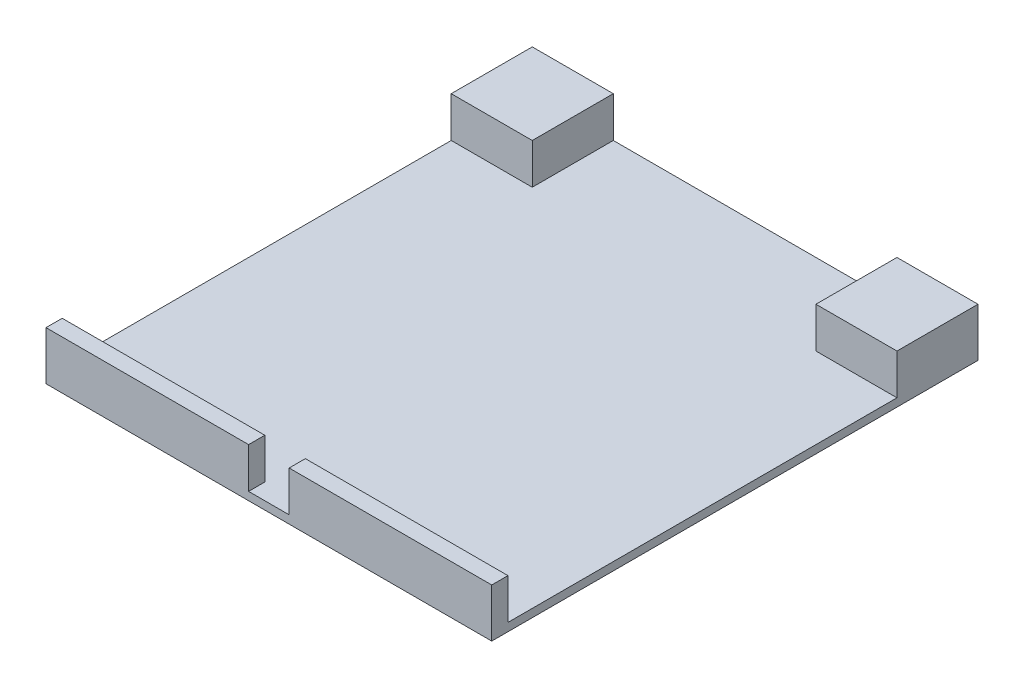
ISO-10303-21;
HEADER;
FILE_DESCRIPTION(('STEP AP214'),'2;1');
FILE_NAME('part.step','',(''),(''),'','','');
FILE_SCHEMA(('AUTOMOTIVE_DESIGN { 1 0 10303 214 1 1 1 1 }'));
ENDSEC;
DATA;
#1=APPLICATION_CONTEXT('core data for automotive mechanical design processes');
#2=APPLICATION_PROTOCOL_DEFINITION('international standard','automotive_design',2000,#1);
#3=PRODUCT_CONTEXT('',#1,'mechanical');
#4=PRODUCT('Part','Part','',(#3));
#5=PRODUCT_RELATED_PRODUCT_CATEGORY('part','',(#4));
#6=PRODUCT_DEFINITION_FORMATION('','',#4);
#7=PRODUCT_DEFINITION_CONTEXT('part definition',#1,'design');
#8=PRODUCT_DEFINITION('design','',#6,#7);
#9=PRODUCT_DEFINITION_SHAPE('','',#8);
#10=(LENGTH_UNIT() NAMED_UNIT(*) SI_UNIT(.MILLI.,.METRE.));
#11=(NAMED_UNIT(*) PLANE_ANGLE_UNIT() SI_UNIT($,.RADIAN.));
#12=(NAMED_UNIT(*) SI_UNIT($,.STERADIAN.) SOLID_ANGLE_UNIT());
#13=UNCERTAINTY_MEASURE_WITH_UNIT(LENGTH_MEASURE(1.E-05),#10,'distance_accuracy_value','');
#14=(GEOMETRIC_REPRESENTATION_CONTEXT(3) GLOBAL_UNCERTAINTY_ASSIGNED_CONTEXT((#13)) GLOBAL_UNIT_ASSIGNED_CONTEXT((#10,
#11,#12)) REPRESENTATION_CONTEXT('',''));
#15=CARTESIAN_POINT('',(0.,0.,0.));
#16=DIRECTION('',(0.,0.,1.));
#17=DIRECTION('',(1.,0.,0.));
#18=AXIS2_PLACEMENT_3D('',#15,#16,#17);
#19=CARTESIAN_POINT('',(0.,1.27,0.));
#20=DIRECTION('',(0.,1.,0.));
#21=DIRECTION('',(0.,0.,1.));
#22=AXIS2_PLACEMENT_3D('',#19,#20,#21);
#23=PLANE('',#22);
#24=DIRECTION('',(0.,0.,1.));
#25=VECTOR('',#24,1.);
#26=CARTESIAN_POINT('',(3.17500000000001,1.27,35.56));
#27=LINE('',#26,#25);
#28=CARTESIAN_POINT('',(3.17500000000001,1.27,35.56));
#29=VERTEX_POINT('',#28);
#30=CARTESIAN_POINT('',(3.17500000000001,1.27,38.1));
#31=VERTEX_POINT('',#30);
#32=EDGE_CURVE('E56',#29,#31,#27,.T.);
#33=ORIENTED_EDGE('',*,*,#32,.F.);
#34=DIRECTION('',(-1.,0.,0.));
#35=VECTOR('',#34,1.);
#36=CARTESIAN_POINT('',(3.17500000000001,1.27,35.56));
#37=LINE('',#36,#35);
#38=CARTESIAN_POINT('',(34.925,1.27,35.56));
#39=VERTEX_POINT('',#38);
#40=EDGE_CURVE('E60',#39,#29,#37,.T.);
#41=ORIENTED_EDGE('',*,*,#40,.F.);
#42=DIRECTION('',(0.,0.,-1.));
#43=VECTOR('',#42,1.);
#44=CARTESIAN_POINT('',(34.925,1.27,-38.1));
#45=LINE('',#44,#43);
#46=CARTESIAN_POINT('',(34.925,1.27,-25.4));
#47=VERTEX_POINT('',#46);
#48=EDGE_CURVE('E174',#39,#47,#45,.T.);
#49=ORIENTED_EDGE('',*,*,#48,.T.);
#50=DIRECTION('',(1.,0.,0.));
#51=VECTOR('',#50,1.);
#52=CARTESIAN_POINT('',(22.225,1.27,-25.4));
#53=LINE('',#52,#51);
#54=CARTESIAN_POINT('',(22.225,1.27,-25.4));
#55=VERTEX_POINT('',#54);
#56=EDGE_CURVE('E178',#55,#47,#53,.T.);
#57=ORIENTED_EDGE('',*,*,#56,.F.);
#58=DIRECTION('',(0.,0.,1.));
#59=VECTOR('',#58,1.);
#60=CARTESIAN_POINT('',(22.225,1.27,-38.1));
#61=LINE('',#60,#59);
#62=CARTESIAN_POINT('',(22.225,1.27,-38.1));
#63=VERTEX_POINT('',#62);
#64=EDGE_CURVE('E175',#63,#55,#61,.T.);
#65=ORIENTED_EDGE('',*,*,#64,.F.);
#66=DIRECTION('',(-1.,0.,0.));
#67=VECTOR('',#66,1.);
#68=CARTESIAN_POINT('',(-34.925,1.27,-38.1));
#69=LINE('',#68,#67);
#70=CARTESIAN_POINT('',(-22.225,1.27,-38.1));
#71=VERTEX_POINT('',#70);
#72=EDGE_CURVE('E255',#63,#71,#69,.T.);
#73=ORIENTED_EDGE('',*,*,#72,.T.);
#74=DIRECTION('',(0.,0.,-1.));
#75=VECTOR('',#74,1.);
#76=CARTESIAN_POINT('',(-22.225,1.27,-38.1));
#77=LINE('',#76,#75);
#78=CARTESIAN_POINT('',(-22.225,1.27,-25.4));
#79=VERTEX_POINT('',#78);
#80=EDGE_CURVE('E228',#79,#71,#77,.T.);
#81=ORIENTED_EDGE('',*,*,#80,.F.);
#82=DIRECTION('',(1.,0.,0.));
#83=VECTOR('',#82,1.);
#84=CARTESIAN_POINT('',(-34.925,1.27,-25.4));
#85=LINE('',#84,#83);
#86=CARTESIAN_POINT('',(-34.925,1.27,-25.4));
#87=VERTEX_POINT('',#86);
#88=EDGE_CURVE('E233',#87,#79,#85,.T.);
#89=ORIENTED_EDGE('',*,*,#88,.F.);
#90=DIRECTION('',(0.,0.,1.));
#91=VECTOR('',#90,1.);
#92=CARTESIAN_POINT('',(-34.925,1.27,-38.1));
#93=LINE('',#92,#91);
#94=CARTESIAN_POINT('',(-34.925,1.27,35.56));
#95=VERTEX_POINT('',#94);
#96=EDGE_CURVE('E258',#87,#95,#93,.T.);
#97=ORIENTED_EDGE('',*,*,#96,.T.);
#98=DIRECTION('',(-1.,0.,0.));
#99=VECTOR('',#98,1.);
#100=CARTESIAN_POINT('',(-34.925,1.27,35.56));
#101=LINE('',#100,#99);
#102=CARTESIAN_POINT('',(-3.17499999999999,1.27,35.56));
#103=VERTEX_POINT('',#102);
#104=EDGE_CURVE('E208',#103,#95,#101,.T.);
#105=ORIENTED_EDGE('',*,*,#104,.F.);
#106=DIRECTION('',(0.,0.,-1.));
#107=VECTOR('',#106,1.);
#108=CARTESIAN_POINT('',(-3.17499999999999,1.27,35.56));
#109=LINE('',#108,#107);
#110=CARTESIAN_POINT('',(-3.17499999999999,1.27,38.1));
#111=VERTEX_POINT('',#110);
#112=EDGE_CURVE('E203',#111,#103,#109,.T.);
#113=ORIENTED_EDGE('',*,*,#112,.F.);
#114=DIRECTION('',(1.,0.,0.));
#115=VECTOR('',#114,1.);
#116=CARTESIAN_POINT('',(-34.925,1.27,38.1));
#117=LINE('',#116,#115);
#118=EDGE_CURVE('E260',#111,#31,#117,.T.);
#119=ORIENTED_EDGE('',*,*,#118,.T.);
#120=EDGE_LOOP('',(#33,#41,#49,#57,#65,#73,#81,#89,#97,#105,#113,#119));
#121=FACE_BOUND('',#120,.T.);
#122=ADVANCED_FACE('F41',(#121),#23,.T.);
#123=CARTESIAN_POINT('',(34.925,1.27,-38.1));
#124=DIRECTION('',(-1.,0.,0.));
#125=DIRECTION('',(0.,0.,1.));
#126=AXIS2_PLACEMENT_3D('',#123,#124,#125);
#127=PLANE('',#126);
#128=DIRECTION('',(0.,0.,-1.));
#129=VECTOR('',#128,1.);
#130=CARTESIAN_POINT('',(34.925,0.,-38.1));
#131=LINE('',#130,#129);
#132=CARTESIAN_POINT('',(34.925,0.,38.1));
#133=VERTEX_POINT('',#132);
#134=CARTESIAN_POINT('',(34.925,0.,-38.1));
#135=VERTEX_POINT('',#134);
#136=EDGE_CURVE('E253',#133,#135,#131,.T.);
#137=ORIENTED_EDGE('',*,*,#136,.T.);
#138=DIRECTION('',(0.,-1.,0.));
#139=VECTOR('',#138,1.);
#140=CARTESIAN_POINT('',(34.925,1.27,-38.1));
#141=LINE('',#140,#139);
#142=CARTESIAN_POINT('',(34.925,7.62,-38.1));
#143=VERTEX_POINT('',#142);
#144=EDGE_CURVE('E11',#143,#135,#141,.T.);
#145=ORIENTED_EDGE('',*,*,#144,.F.);
#146=DIRECTION('',(0.,0.,-1.));
#147=VECTOR('',#146,1.);
#148=CARTESIAN_POINT('',(34.925,7.62,-38.1));
#149=LINE('',#148,#147);
#150=CARTESIAN_POINT('',(34.925,7.62,-25.4));
#151=VERTEX_POINT('',#150);
#152=EDGE_CURVE('E184',#151,#143,#149,.T.);
#153=ORIENTED_EDGE('',*,*,#152,.F.);
#154=DIRECTION('',(0.,-1.,0.));
#155=VECTOR('',#154,1.);
#156=CARTESIAN_POINT('',(34.925,7.62,-25.4));
#157=LINE('',#156,#155);
#158=EDGE_CURVE('E192',#151,#47,#157,.T.);
#159=ORIENTED_EDGE('',*,*,#158,.T.);
#160=ORIENTED_EDGE('',*,*,#48,.F.);
#161=DIRECTION('',(0.,-1.,0.));
#162=VECTOR('',#161,1.);
#163=CARTESIAN_POINT('',(34.925,7.62,35.56));
#164=LINE('',#163,#162);
#165=CARTESIAN_POINT('',(34.925,7.62,35.56));
#166=VERTEX_POINT('',#165);
#167=EDGE_CURVE('E156',#166,#39,#164,.T.);
#168=ORIENTED_EDGE('',*,*,#167,.F.);
#169=DIRECTION('',(0.,0.,-1.));
#170=VECTOR('',#169,1.);
#171=CARTESIAN_POINT('',(34.925,7.62,35.56));
#172=LINE('',#171,#170);
#173=CARTESIAN_POINT('',(34.925,7.62,38.1));
#174=VERTEX_POINT('',#173);
#175=EDGE_CURVE('E162',#174,#166,#172,.T.);
#176=ORIENTED_EDGE('',*,*,#175,.F.);
#177=DIRECTION('',(0.,-1.,0.));
#178=VECTOR('',#177,1.);
#179=CARTESIAN_POINT('',(34.925,1.27,38.1));
#180=LINE('',#179,#178);
#181=EDGE_CURVE('E262',#174,#133,#180,.T.);
#182=ORIENTED_EDGE('',*,*,#181,.T.);
#183=EDGE_LOOP('',(#137,#145,#153,#159,#160,#168,#176,#182));
#184=FACE_BOUND('',#183,.T.);
#185=ADVANCED_FACE('F43',(#184),#127,.F.);
#186=CARTESIAN_POINT('',(-34.925,1.27,-38.1));
#187=DIRECTION('',(0.,0.,1.));
#188=DIRECTION('',(1.,0.,0.));
#189=AXIS2_PLACEMENT_3D('',#186,#187,#188);
#190=PLANE('',#189);
#191=DIRECTION('',(-1.,0.,0.));
#192=VECTOR('',#191,1.);
#193=CARTESIAN_POINT('',(-34.925,0.,-38.1));
#194=LINE('',#193,#192);
#195=CARTESIAN_POINT('',(-34.925,0.,-38.1));
#196=VERTEX_POINT('',#195);
#197=EDGE_CURVE('E264',#135,#196,#194,.T.);
#198=ORIENTED_EDGE('',*,*,#197,.T.);
#199=DIRECTION('',(0.,-1.,0.));
#200=VECTOR('',#199,1.);
#201=CARTESIAN_POINT('',(-34.925,1.27,-38.1));
#202=LINE('',#201,#200);
#203=CARTESIAN_POINT('',(-34.925,7.62,-38.1));
#204=VERTEX_POINT('',#203);
#205=EDGE_CURVE('E49',#204,#196,#202,.T.);
#206=ORIENTED_EDGE('',*,*,#205,.F.);
#207=DIRECTION('',(-1.,0.,0.));
#208=VECTOR('',#207,1.);
#209=CARTESIAN_POINT('',(-34.925,7.62,-38.1));
#210=LINE('',#209,#208);
#211=CARTESIAN_POINT('',(-22.225,7.62,-38.1));
#212=VERTEX_POINT('',#211);
#213=EDGE_CURVE('E232',#212,#204,#210,.T.);
#214=ORIENTED_EDGE('',*,*,#213,.F.);
#215=DIRECTION('',(0.,-1.,0.));
#216=VECTOR('',#215,1.);
#217=CARTESIAN_POINT('',(-22.225,7.62,-38.1));
#218=LINE('',#217,#216);
#219=EDGE_CURVE('E250',#212,#71,#218,.T.);
#220=ORIENTED_EDGE('',*,*,#219,.T.);
#221=ORIENTED_EDGE('',*,*,#72,.F.);
#222=DIRECTION('',(0.,-1.,0.));
#223=VECTOR('',#222,1.);
#224=CARTESIAN_POINT('',(22.225,7.62,-38.1));
#225=LINE('',#224,#223);
#226=CARTESIAN_POINT('',(22.225,7.62,-38.1));
#227=VERTEX_POINT('',#226);
#228=EDGE_CURVE('E200',#227,#63,#225,.T.);
#229=ORIENTED_EDGE('',*,*,#228,.F.);
#230=DIRECTION('',(-1.,0.,0.));
#231=VECTOR('',#230,1.);
#232=CARTESIAN_POINT('',(22.225,7.62,-38.1));
#233=LINE('',#232,#231);
#234=EDGE_CURVE('E187',#143,#227,#233,.T.);
#235=ORIENTED_EDGE('',*,*,#234,.F.);
#236=ORIENTED_EDGE('',*,*,#144,.T.);
#237=EDGE_LOOP('',(#198,#206,#214,#220,#221,#229,#235,#236));
#238=FACE_BOUND('',#237,.T.);
#239=ADVANCED_FACE('F289',(#238),#190,.F.);
#240=CARTESIAN_POINT('',(-34.925,1.27,-38.1));
#241=DIRECTION('',(1.,0.,0.));
#242=DIRECTION('',(0.,0.,-1.));
#243=AXIS2_PLACEMENT_3D('',#240,#241,#242);
#244=PLANE('',#243);
#245=DIRECTION('',(0.,0.,1.));
#246=VECTOR('',#245,1.);
#247=CARTESIAN_POINT('',(-34.925,0.,-38.1));
#248=LINE('',#247,#246);
#249=CARTESIAN_POINT('',(-34.925,0.,38.1));
#250=VERTEX_POINT('',#249);
#251=EDGE_CURVE('E266',#196,#250,#248,.T.);
#252=ORIENTED_EDGE('',*,*,#251,.T.);
#253=DIRECTION('',(0.,-1.,0.));
#254=VECTOR('',#253,1.);
#255=CARTESIAN_POINT('',(-34.925,1.27,38.1));
#256=LINE('',#255,#254);
#257=CARTESIAN_POINT('',(-34.925,7.62,38.1));
#258=VERTEX_POINT('',#257);
#259=EDGE_CURVE('E270',#258,#250,#256,.T.);
#260=ORIENTED_EDGE('',*,*,#259,.F.);
#261=DIRECTION('',(0.,0.,1.));
#262=VECTOR('',#261,1.);
#263=CARTESIAN_POINT('',(-34.925,7.62,35.56));
#264=LINE('',#263,#262);
#265=CARTESIAN_POINT('',(-34.925,7.62,35.56));
#266=VERTEX_POINT('',#265);
#267=EDGE_CURVE('E210',#266,#258,#264,.T.);
#268=ORIENTED_EDGE('',*,*,#267,.F.);
#269=DIRECTION('',(0.,-1.,0.));
#270=VECTOR('',#269,1.);
#271=CARTESIAN_POINT('',(-34.925,7.62,35.56));
#272=LINE('',#271,#270);
#273=EDGE_CURVE('E222',#266,#95,#272,.T.);
#274=ORIENTED_EDGE('',*,*,#273,.T.);
#275=ORIENTED_EDGE('',*,*,#96,.F.);
#276=DIRECTION('',(0.,-1.,0.));
#277=VECTOR('',#276,1.);
#278=CARTESIAN_POINT('',(-34.925,7.62,-25.4));
#279=LINE('',#278,#277);
#280=CARTESIAN_POINT('',(-34.925,7.62,-25.4));
#281=VERTEX_POINT('',#280);
#282=EDGE_CURVE('E247',#281,#87,#279,.T.);
#283=ORIENTED_EDGE('',*,*,#282,.F.);
#284=DIRECTION('',(0.,0.,1.));
#285=VECTOR('',#284,1.);
#286=CARTESIAN_POINT('',(-34.925,7.62,-38.1));
#287=LINE('',#286,#285);
#288=EDGE_CURVE('E236',#204,#281,#287,.T.);
#289=ORIENTED_EDGE('',*,*,#288,.F.);
#290=ORIENTED_EDGE('',*,*,#205,.T.);
#291=EDGE_LOOP('',(#252,#260,#268,#274,#275,#283,#289,#290));
#292=FACE_BOUND('',#291,.T.);
#293=ADVANCED_FACE('F276',(#292),#244,.F.);
#294=CARTESIAN_POINT('',(-34.925,1.27,38.1));
#295=DIRECTION('',(0.,0.,-1.));
#296=DIRECTION('',(-1.,0.,0.));
#297=AXIS2_PLACEMENT_3D('',#294,#295,#296);
#298=PLANE('',#297);
#299=DIRECTION('',(1.,0.,0.));
#300=VECTOR('',#299,1.);
#301=CARTESIAN_POINT('',(-34.925,0.,38.1));
#302=LINE('',#301,#300);
#303=EDGE_CURVE('E256',#250,#133,#302,.T.);
#304=ORIENTED_EDGE('',*,*,#303,.T.);
#305=ORIENTED_EDGE('',*,*,#181,.F.);
#306=DIRECTION('',(1.,0.,0.));
#307=VECTOR('',#306,1.);
#308=CARTESIAN_POINT('',(3.17500000000001,7.62,38.1));
#309=LINE('',#308,#307);
#310=CARTESIAN_POINT('',(3.17500000000001,7.62,38.1));
#311=VERTEX_POINT('',#310);
#312=EDGE_CURVE('E168',#311,#174,#309,.T.);
#313=ORIENTED_EDGE('',*,*,#312,.F.);
#314=DIRECTION('',(0.,-1.,0.));
#315=VECTOR('',#314,1.);
#316=CARTESIAN_POINT('',(3.17500000000001,7.62,38.1));
#317=LINE('',#316,#315);
#318=EDGE_CURVE('E180',#311,#31,#317,.T.);
#319=ORIENTED_EDGE('',*,*,#318,.T.);
#320=ORIENTED_EDGE('',*,*,#118,.F.);
#321=DIRECTION('',(0.,-1.,0.));
#322=VECTOR('',#321,1.);
#323=CARTESIAN_POINT('',(-3.17499999999999,7.62,38.1));
#324=LINE('',#323,#322);
#325=CARTESIAN_POINT('',(-3.17499999999999,7.62,38.1));
#326=VERTEX_POINT('',#325);
#327=EDGE_CURVE('E215',#326,#111,#324,.T.);
#328=ORIENTED_EDGE('',*,*,#327,.F.);
#329=DIRECTION('',(1.,0.,0.));
#330=VECTOR('',#329,1.);
#331=CARTESIAN_POINT('',(-34.925,7.62,38.1));
#332=LINE('',#331,#330);
#333=EDGE_CURVE('E213',#258,#326,#332,.T.);
#334=ORIENTED_EDGE('',*,*,#333,.F.);
#335=ORIENTED_EDGE('',*,*,#259,.T.);
#336=EDGE_LOOP('',(#304,#305,#313,#319,#320,#328,#334,#335));
#337=FACE_BOUND('',#336,.T.);
#338=ADVANCED_FACE('F284',(#337),#298,.F.);
#339=CARTESIAN_POINT('',(0.,0.,0.));
#340=DIRECTION('',(0.,1.,0.));
#341=DIRECTION('',(0.,0.,1.));
#342=AXIS2_PLACEMENT_3D('',#339,#340,#341);
#343=PLANE('',#342);
#344=ORIENTED_EDGE('',*,*,#136,.F.);
#345=ORIENTED_EDGE('',*,*,#303,.F.);
#346=ORIENTED_EDGE('',*,*,#251,.F.);
#347=ORIENTED_EDGE('',*,*,#197,.F.);
#348=EDGE_LOOP('',(#344,#345,#346,#347));
#349=FACE_BOUND('',#348,.T.);
#350=ADVANCED_FACE('F282',(#349),#343,.F.);
#351=CARTESIAN_POINT('',(-22.225,7.62,-38.1));
#352=DIRECTION('',(-1.,0.,0.));
#353=DIRECTION('',(0.,0.,1.));
#354=AXIS2_PLACEMENT_3D('',#351,#352,#353);
#355=PLANE('',#354);
#356=ORIENTED_EDGE('',*,*,#80,.T.);
#357=ORIENTED_EDGE('',*,*,#219,.F.);
#358=DIRECTION('',(0.,0.,-1.));
#359=VECTOR('',#358,1.);
#360=CARTESIAN_POINT('',(-22.225,7.62,-38.1));
#361=LINE('',#360,#359);
#362=CARTESIAN_POINT('',(-22.225,7.62,-25.4));
#363=VERTEX_POINT('',#362);
#364=EDGE_CURVE('E229',#363,#212,#361,.T.);
#365=ORIENTED_EDGE('',*,*,#364,.F.);
#366=DIRECTION('',(0.,-1.,0.));
#367=VECTOR('',#366,1.);
#368=CARTESIAN_POINT('',(-22.225,7.62,-25.4));
#369=LINE('',#368,#367);
#370=EDGE_CURVE('E240',#363,#79,#369,.T.);
#371=ORIENTED_EDGE('',*,*,#370,.T.);
#372=EDGE_LOOP('',(#356,#357,#365,#371));
#373=FACE_BOUND('',#372,.T.);
#374=ADVANCED_FACE('F319',(#373),#355,.F.);
#375=CARTESIAN_POINT('',(-34.925,7.62,-25.4));
#376=DIRECTION('',(0.,0.,-1.));
#377=DIRECTION('',(-1.,0.,0.));
#378=AXIS2_PLACEMENT_3D('',#375,#376,#377);
#379=PLANE('',#378);
#380=ORIENTED_EDGE('',*,*,#88,.T.);
#381=ORIENTED_EDGE('',*,*,#370,.F.);
#382=DIRECTION('',(1.,0.,0.));
#383=VECTOR('',#382,1.);
#384=CARTESIAN_POINT('',(-34.925,7.62,-25.4));
#385=LINE('',#384,#383);
#386=EDGE_CURVE('E238',#281,#363,#385,.T.);
#387=ORIENTED_EDGE('',*,*,#386,.F.);
#388=ORIENTED_EDGE('',*,*,#282,.T.);
#389=EDGE_LOOP('',(#380,#381,#387,#388));
#390=FACE_BOUND('',#389,.T.);
#391=ADVANCED_FACE('F349',(#390),#379,.F.);
#392=CARTESIAN_POINT('',(0.,7.62,0.));
#393=DIRECTION('',(0.,1.,0.));
#394=DIRECTION('',(0.,0.,1.));
#395=AXIS2_PLACEMENT_3D('',#392,#393,#394);
#396=PLANE('',#395);
#397=ORIENTED_EDGE('',*,*,#364,.T.);
#398=ORIENTED_EDGE('',*,*,#213,.T.);
#399=ORIENTED_EDGE('',*,*,#288,.T.);
#400=ORIENTED_EDGE('',*,*,#386,.T.);
#401=EDGE_LOOP('',(#397,#398,#399,#400));
#402=FACE_BOUND('',#401,.T.);
#403=ADVANCED_FACE('F356',(#402),#396,.T.);
#404=CARTESIAN_POINT('',(-3.17499999999999,7.62,35.56));
#405=DIRECTION('',(-1.,0.,0.));
#406=DIRECTION('',(0.,0.,1.));
#407=AXIS2_PLACEMENT_3D('',#404,#405,#406);
#408=PLANE('',#407);
#409=ORIENTED_EDGE('',*,*,#112,.T.);
#410=DIRECTION('',(0.,-1.,0.));
#411=VECTOR('',#410,1.);
#412=CARTESIAN_POINT('',(-3.17499999999999,7.62,35.56));
#413=LINE('',#412,#411);
#414=CARTESIAN_POINT('',(-3.17499999999999,7.62,35.56));
#415=VERTEX_POINT('',#414);
#416=EDGE_CURVE('E225',#415,#103,#413,.T.);
#417=ORIENTED_EDGE('',*,*,#416,.F.);
#418=DIRECTION('',(0.,0.,-1.));
#419=VECTOR('',#418,1.);
#420=CARTESIAN_POINT('',(-3.17499999999999,7.62,35.56));
#421=LINE('',#420,#419);
#422=EDGE_CURVE('E204',#326,#415,#421,.T.);
#423=ORIENTED_EDGE('',*,*,#422,.F.);
#424=ORIENTED_EDGE('',*,*,#327,.T.);
#425=EDGE_LOOP('',(#409,#417,#423,#424));
#426=FACE_BOUND('',#425,.T.);
#427=ADVANCED_FACE('F363',(#426),#408,.F.);
#428=CARTESIAN_POINT('',(-34.925,7.62,35.56));
#429=DIRECTION('',(0.,0.,1.));
#430=DIRECTION('',(1.,0.,0.));
#431=AXIS2_PLACEMENT_3D('',#428,#429,#430);
#432=PLANE('',#431);
#433=ORIENTED_EDGE('',*,*,#104,.T.);
#434=ORIENTED_EDGE('',*,*,#273,.F.);
#435=DIRECTION('',(-1.,0.,0.));
#436=VECTOR('',#435,1.);
#437=CARTESIAN_POINT('',(-34.925,7.62,35.56));
#438=LINE('',#437,#436);
#439=EDGE_CURVE('E207',#415,#266,#438,.T.);
#440=ORIENTED_EDGE('',*,*,#439,.F.);
#441=ORIENTED_EDGE('',*,*,#416,.T.);
#442=EDGE_LOOP('',(#433,#434,#440,#441));
#443=FACE_BOUND('',#442,.T.);
#444=ADVANCED_FACE('F309',(#443),#432,.F.);
#445=CARTESIAN_POINT('',(0.,7.62,0.));
#446=DIRECTION('',(0.,1.,0.));
#447=DIRECTION('',(0.,0.,1.));
#448=AXIS2_PLACEMENT_3D('',#445,#446,#447);
#449=PLANE('',#448);
#450=ORIENTED_EDGE('',*,*,#422,.T.);
#451=ORIENTED_EDGE('',*,*,#439,.T.);
#452=ORIENTED_EDGE('',*,*,#267,.T.);
#453=ORIENTED_EDGE('',*,*,#333,.T.);
#454=EDGE_LOOP('',(#450,#451,#452,#453));
#455=FACE_BOUND('',#454,.T.);
#456=ADVANCED_FACE('F302',(#455),#449,.T.);
#457=CARTESIAN_POINT('',(22.225,7.62,-38.1));
#458=DIRECTION('',(1.,0.,0.));
#459=DIRECTION('',(0.,0.,-1.));
#460=AXIS2_PLACEMENT_3D('',#457,#458,#459);
#461=PLANE('',#460);
#462=ORIENTED_EDGE('',*,*,#64,.T.);
#463=DIRECTION('',(0.,-1.,0.));
#464=VECTOR('',#463,1.);
#465=CARTESIAN_POINT('',(22.225,7.62,-25.4));
#466=LINE('',#465,#464);
#467=CARTESIAN_POINT('',(22.225,7.62,-25.4));
#468=VERTEX_POINT('',#467);
#469=EDGE_CURVE('E197',#468,#55,#466,.T.);
#470=ORIENTED_EDGE('',*,*,#469,.F.);
#471=DIRECTION('',(0.,0.,1.));
#472=VECTOR('',#471,1.);
#473=CARTESIAN_POINT('',(22.225,7.62,-38.1));
#474=LINE('',#473,#472);
#475=EDGE_CURVE('E189',#227,#468,#474,.T.);
#476=ORIENTED_EDGE('',*,*,#475,.F.);
#477=ORIENTED_EDGE('',*,*,#228,.T.);
#478=EDGE_LOOP('',(#462,#470,#476,#477));
#479=FACE_BOUND('',#478,.T.);
#480=ADVANCED_FACE('F300',(#479),#461,.F.);
#481=CARTESIAN_POINT('',(22.225,7.62,-25.4));
#482=DIRECTION('',(0.,0.,-1.));
#483=DIRECTION('',(-1.,0.,0.));
#484=AXIS2_PLACEMENT_3D('',#481,#482,#483);
#485=PLANE('',#484);
#486=ORIENTED_EDGE('',*,*,#56,.T.);
#487=ORIENTED_EDGE('',*,*,#158,.F.);
#488=DIRECTION('',(1.,0.,0.));
#489=VECTOR('',#488,1.);
#490=CARTESIAN_POINT('',(22.225,7.62,-25.4));
#491=LINE('',#490,#489);
#492=EDGE_CURVE('E191',#468,#151,#491,.T.);
#493=ORIENTED_EDGE('',*,*,#492,.F.);
#494=ORIENTED_EDGE('',*,*,#469,.T.);
#495=EDGE_LOOP('',(#486,#487,#493,#494));
#496=FACE_BOUND('',#495,.T.);
#497=ADVANCED_FACE('F297',(#496),#485,.F.);
#498=CARTESIAN_POINT('',(0.,7.62,0.));
#499=DIRECTION('',(0.,1.,0.));
#500=DIRECTION('',(0.,0.,1.));
#501=AXIS2_PLACEMENT_3D('',#498,#499,#500);
#502=PLANE('',#501);
#503=ORIENTED_EDGE('',*,*,#152,.T.);
#504=ORIENTED_EDGE('',*,*,#234,.T.);
#505=ORIENTED_EDGE('',*,*,#475,.T.);
#506=ORIENTED_EDGE('',*,*,#492,.T.);
#507=EDGE_LOOP('',(#503,#504,#505,#506));
#508=FACE_BOUND('',#507,.T.);
#509=ADVANCED_FACE('F292',(#508),#502,.T.);
#510=CARTESIAN_POINT('',(3.17500000000001,7.62,35.56));
#511=DIRECTION('',(0.,0.,1.));
#512=DIRECTION('',(1.,0.,0.));
#513=AXIS2_PLACEMENT_3D('',#510,#511,#512);
#514=PLANE('',#513);
#515=ORIENTED_EDGE('',*,*,#40,.T.);
#516=DIRECTION('',(0.,-1.,0.));
#517=VECTOR('',#516,1.);
#518=CARTESIAN_POINT('',(3.17500000000001,7.62,35.56));
#519=LINE('',#518,#517);
#520=CARTESIAN_POINT('',(3.17500000000001,7.62,35.56));
#521=VERTEX_POINT('',#520);
#522=EDGE_CURVE('E158',#521,#29,#519,.T.);
#523=ORIENTED_EDGE('',*,*,#522,.F.);
#524=DIRECTION('',(-1.,0.,0.));
#525=VECTOR('',#524,1.);
#526=CARTESIAN_POINT('',(3.17500000000001,7.62,35.56));
#527=LINE('',#526,#525);
#528=EDGE_CURVE('E152',#166,#521,#527,.T.);
#529=ORIENTED_EDGE('',*,*,#528,.F.);
#530=ORIENTED_EDGE('',*,*,#167,.T.);
#531=EDGE_LOOP('',(#515,#523,#529,#530));
#532=FACE_BOUND('',#531,.T.);
#533=ADVANCED_FACE('F154',(#532),#514,.F.);
#534=CARTESIAN_POINT('',(3.17500000000001,7.62,35.56));
#535=DIRECTION('',(1.,0.,0.));
#536=DIRECTION('',(0.,0.,-1.));
#537=AXIS2_PLACEMENT_3D('',#534,#535,#536);
#538=PLANE('',#537);
#539=ORIENTED_EDGE('',*,*,#32,.T.);
#540=ORIENTED_EDGE('',*,*,#318,.F.);
#541=DIRECTION('',(0.,0.,1.));
#542=VECTOR('',#541,1.);
#543=CARTESIAN_POINT('',(3.17500000000001,7.62,35.56));
#544=LINE('',#543,#542);
#545=EDGE_CURVE('E161',#521,#311,#544,.T.);
#546=ORIENTED_EDGE('',*,*,#545,.F.);
#547=ORIENTED_EDGE('',*,*,#522,.T.);
#548=EDGE_LOOP('',(#539,#540,#546,#547));
#549=FACE_BOUND('',#548,.T.);
#550=ADVANCED_FACE('F397',(#549),#538,.F.);
#551=CARTESIAN_POINT('',(0.,7.62,0.));
#552=DIRECTION('',(0.,1.,0.));
#553=DIRECTION('',(0.,0.,1.));
#554=AXIS2_PLACEMENT_3D('',#551,#552,#553);
#555=PLANE('',#554);
#556=ORIENTED_EDGE('',*,*,#175,.T.);
#557=ORIENTED_EDGE('',*,*,#528,.T.);
#558=ORIENTED_EDGE('',*,*,#545,.T.);
#559=ORIENTED_EDGE('',*,*,#312,.T.);
#560=EDGE_LOOP('',(#556,#557,#558,#559));
#561=FACE_BOUND('',#560,.T.);
#562=ADVANCED_FACE('F166',(#561),#555,.T.);
#563=CLOSED_SHELL('',(#122,#185,#239,#293,#338,#350,#374,#391,#403,#427,#444,#456,#480,#497,
#509,#533,#550,#562));
#564=MANIFOLD_SOLID_BREP('B2',#563);
#565=ADVANCED_BREP_SHAPE_REPRESENTATION('',(#18,#564),#14);
#566=SHAPE_DEFINITION_REPRESENTATION(#9,#565);
ENDSEC;
END-ISO-10303-21;
